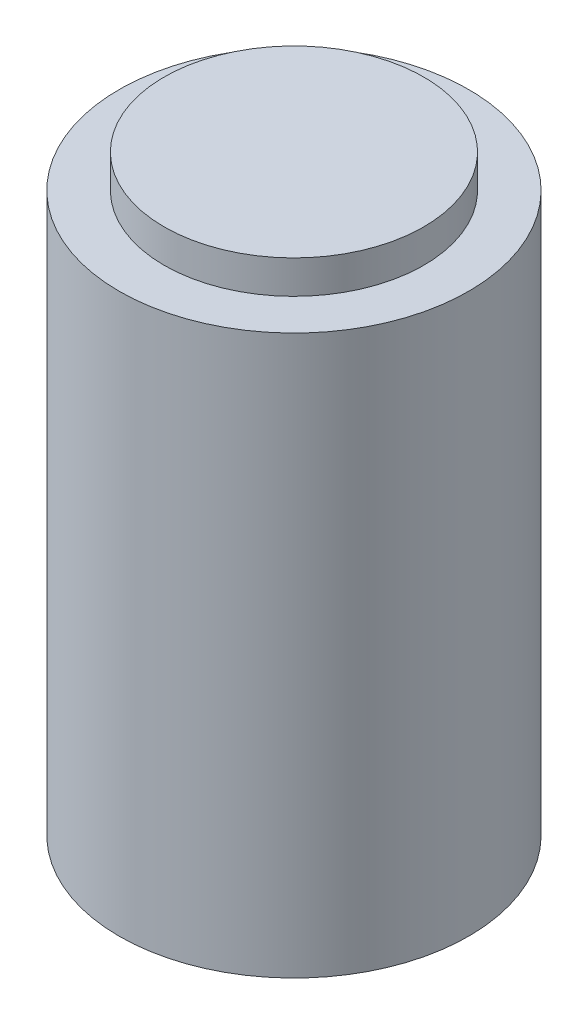
ISO-10303-21;
HEADER;
FILE_DESCRIPTION(('STEP AP214'),'2;1');
FILE_NAME('part.step','',(''),(''),'','','');
FILE_SCHEMA(('AUTOMOTIVE_DESIGN { 1 0 10303 214 1 1 1 1 }'));
ENDSEC;
DATA;
#1=APPLICATION_CONTEXT('core data for automotive mechanical design processes');
#2=APPLICATION_PROTOCOL_DEFINITION('international standard','automotive_design',2000,#1);
#3=PRODUCT_CONTEXT('',#1,'mechanical');
#4=PRODUCT('Part','Part','',(#3));
#5=PRODUCT_RELATED_PRODUCT_CATEGORY('part','',(#4));
#6=PRODUCT_DEFINITION_FORMATION('','',#4);
#7=PRODUCT_DEFINITION_CONTEXT('part definition',#1,'design');
#8=PRODUCT_DEFINITION('design','',#6,#7);
#9=PRODUCT_DEFINITION_SHAPE('','',#8);
#10=(LENGTH_UNIT() NAMED_UNIT(*) SI_UNIT(.MILLI.,.METRE.));
#11=(NAMED_UNIT(*) PLANE_ANGLE_UNIT() SI_UNIT($,.RADIAN.));
#12=(NAMED_UNIT(*) SI_UNIT($,.STERADIAN.) SOLID_ANGLE_UNIT());
#13=UNCERTAINTY_MEASURE_WITH_UNIT(LENGTH_MEASURE(1.E-05),#10,'distance_accuracy_value','');
#14=(GEOMETRIC_REPRESENTATION_CONTEXT(3) GLOBAL_UNCERTAINTY_ASSIGNED_CONTEXT((#13)) GLOBAL_UNIT_ASSIGNED_CONTEXT((#10,
#11,#12)) REPRESENTATION_CONTEXT('',''));
#15=CARTESIAN_POINT('',(0.,0.,0.));
#16=DIRECTION('',(0.,0.,1.));
#17=DIRECTION('',(1.,0.,0.));
#18=AXIS2_PLACEMENT_3D('',#15,#16,#17);
#19=CARTESIAN_POINT('',(0.,83.9,0.));
#20=DIRECTION('',(0.,-1.,0.));
#21=DIRECTION('',(0.,0.,-1.));
#22=AXIS2_PLACEMENT_3D('',#19,#20,#21);
#23=CYLINDRICAL_SURFACE('',#22,26.25);
#24=CARTESIAN_POINT('',(0.,83.9,0.));
#25=DIRECTION('',(0.,1.,0.));
#26=DIRECTION('',(0.,0.,1.));
#27=AXIS2_PLACEMENT_3D('',#24,#25,#26);
#28=CIRCLE('',#27,26.25);
#29=CARTESIAN_POINT('',(0.,83.9,26.25));
#30=VERTEX_POINT('',#29);
#31=EDGE_CURVE('E49',#30,#30,#28,.T.);
#32=ORIENTED_EDGE('',*,*,#31,.F.);
#33=EDGE_LOOP('',(#32));
#34=FACE_BOUND('',#33,.T.);
#35=CARTESIAN_POINT('',(0.,0.,0.));
#36=DIRECTION('',(0.,1.,0.));
#37=DIRECTION('',(0.,0.,1.));
#38=AXIS2_PLACEMENT_3D('',#35,#36,#37);
#39=CIRCLE('',#38,26.25);
#40=CARTESIAN_POINT('',(0.,0.,26.25));
#41=VERTEX_POINT('',#40);
#42=EDGE_CURVE('E44',#41,#41,#39,.T.);
#43=ORIENTED_EDGE('',*,*,#42,.T.);
#44=EDGE_LOOP('',(#43));
#45=FACE_BOUND('',#44,.T.);
#46=ADVANCED_FACE('F41',(#34,#45),#23,.T.);
#47=CARTESIAN_POINT('',(0.,83.9,0.));
#48=DIRECTION('',(0.,1.,0.));
#49=DIRECTION('',(0.,0.,1.));
#50=AXIS2_PLACEMENT_3D('',#47,#48,#49);
#51=PLANE('',#50);
#52=CARTESIAN_POINT('',(0.,83.9,0.));
#53=DIRECTION('',(0.,1.,0.));
#54=DIRECTION('',(0.,0.,1.));
#55=AXIS2_PLACEMENT_3D('',#52,#53,#54);
#56=CIRCLE('',#55,19.5);
#57=CARTESIAN_POINT('',(0.,83.9,19.5));
#58=VERTEX_POINT('',#57);
#59=EDGE_CURVE('E10',#58,#58,#56,.T.);
#60=ORIENTED_EDGE('',*,*,#59,.F.);
#61=EDGE_LOOP('',(#60));
#62=FACE_BOUND('',#61,.T.);
#63=ORIENTED_EDGE('',*,*,#31,.T.);
#64=EDGE_LOOP('',(#63));
#65=FACE_BOUND('',#64,.T.);
#66=ADVANCED_FACE('F86',(#62,#65),#51,.T.);
#67=CARTESIAN_POINT('',(0.,0.,0.));
#68=DIRECTION('',(0.,1.,0.));
#69=DIRECTION('',(0.,0.,1.));
#70=AXIS2_PLACEMENT_3D('',#67,#68,#69);
#71=PLANE('',#70);
#72=CARTESIAN_POINT('',(0.,0.,0.));
#73=DIRECTION('',(0.,-1.,0.));
#74=DIRECTION('',(0.,0.,-1.));
#75=AXIS2_PLACEMENT_3D('',#72,#73,#74);
#76=CIRCLE('',#75,14.01);
#77=CARTESIAN_POINT('',(0.,0.,-14.01));
#78=VERTEX_POINT('',#77);
#79=EDGE_CURVE('E62',#78,#78,#76,.T.);
#80=ORIENTED_EDGE('',*,*,#79,.F.);
#81=EDGE_LOOP('',(#80));
#82=FACE_BOUND('',#81,.T.);
#83=ORIENTED_EDGE('',*,*,#42,.F.);
#84=EDGE_LOOP('',(#83));
#85=FACE_BOUND('',#84,.T.);
#86=ADVANCED_FACE('F91',(#82,#85),#71,.F.);
#87=CARTESIAN_POINT('',(0.,75.9,0.));
#88=DIRECTION('',(0.,-1.,0.));
#89=DIRECTION('',(0.,0.,-1.));
#90=AXIS2_PLACEMENT_3D('',#87,#88,#89);
#91=CYLINDRICAL_SURFACE('',#90,14.01);
#92=CARTESIAN_POINT('',(0.,75.9,0.));
#93=DIRECTION('',(0.,-1.,0.));
#94=DIRECTION('',(0.,0.,-1.));
#95=AXIS2_PLACEMENT_3D('',#92,#93,#94);
#96=CIRCLE('',#95,14.01);
#97=CARTESIAN_POINT('',(0.,75.9,-14.01));
#98=VERTEX_POINT('',#97);
#99=EDGE_CURVE('E58',#98,#98,#96,.T.);
#100=ORIENTED_EDGE('',*,*,#99,.F.);
#101=EDGE_LOOP('',(#100));
#102=FACE_BOUND('',#101,.T.);
#103=ORIENTED_EDGE('',*,*,#79,.T.);
#104=EDGE_LOOP('',(#103));
#105=FACE_BOUND('',#104,.T.);
#106=ADVANCED_FACE('F82',(#102,#105),#91,.F.);
#107=CARTESIAN_POINT('',(0.,75.9,0.));
#108=DIRECTION('',(0.,-1.,0.));
#109=DIRECTION('',(0.,0.,-1.));
#110=AXIS2_PLACEMENT_3D('',#107,#108,#109);
#111=PLANE('',#110);
#112=ORIENTED_EDGE('',*,*,#99,.T.);
#113=EDGE_LOOP('',(#112));
#114=FACE_BOUND('',#113,.T.);
#115=ADVANCED_FACE('F75',(#114),#111,.T.);
#116=CARTESIAN_POINT('',(0.,88.9,0.));
#117=DIRECTION('',(0.,-1.,0.));
#118=DIRECTION('',(0.,0.,-1.));
#119=AXIS2_PLACEMENT_3D('',#116,#117,#118);
#120=CYLINDRICAL_SURFACE('',#119,19.5);
#121=CARTESIAN_POINT('',(0.,88.9,0.));
#122=DIRECTION('',(0.,1.,0.));
#123=DIRECTION('',(0.,0.,1.));
#124=AXIS2_PLACEMENT_3D('',#121,#122,#123);
#125=CIRCLE('',#124,19.5);
#126=CARTESIAN_POINT('',(0.,88.9,19.5));
#127=VERTEX_POINT('',#126);
#128=EDGE_CURVE('E57',#127,#127,#125,.T.);
#129=ORIENTED_EDGE('',*,*,#128,.F.);
#130=EDGE_LOOP('',(#129));
#131=FACE_BOUND('',#130,.T.);
#132=ORIENTED_EDGE('',*,*,#59,.T.);
#133=EDGE_LOOP('',(#132));
#134=FACE_BOUND('',#133,.T.);
#135=ADVANCED_FACE('F73',(#131,#134),#120,.T.);
#136=CARTESIAN_POINT('',(0.,88.9,0.));
#137=DIRECTION('',(0.,1.,0.));
#138=DIRECTION('',(0.,0.,1.));
#139=AXIS2_PLACEMENT_3D('',#136,#137,#138);
#140=PLANE('',#139);
#141=ORIENTED_EDGE('',*,*,#128,.T.);
#142=EDGE_LOOP('',(#141));
#143=FACE_BOUND('',#142,.T.);
#144=ADVANCED_FACE('F71',(#143),#140,.T.);
#145=CLOSED_SHELL('',(#46,#66,#86,#106,#115,#135,#144));
#146=MANIFOLD_SOLID_BREP('B2',#145);
#147=ADVANCED_BREP_SHAPE_REPRESENTATION('',(#18,#146),#14);
#148=SHAPE_DEFINITION_REPRESENTATION(#9,#147);
ENDSEC;
END-ISO-10303-21;
